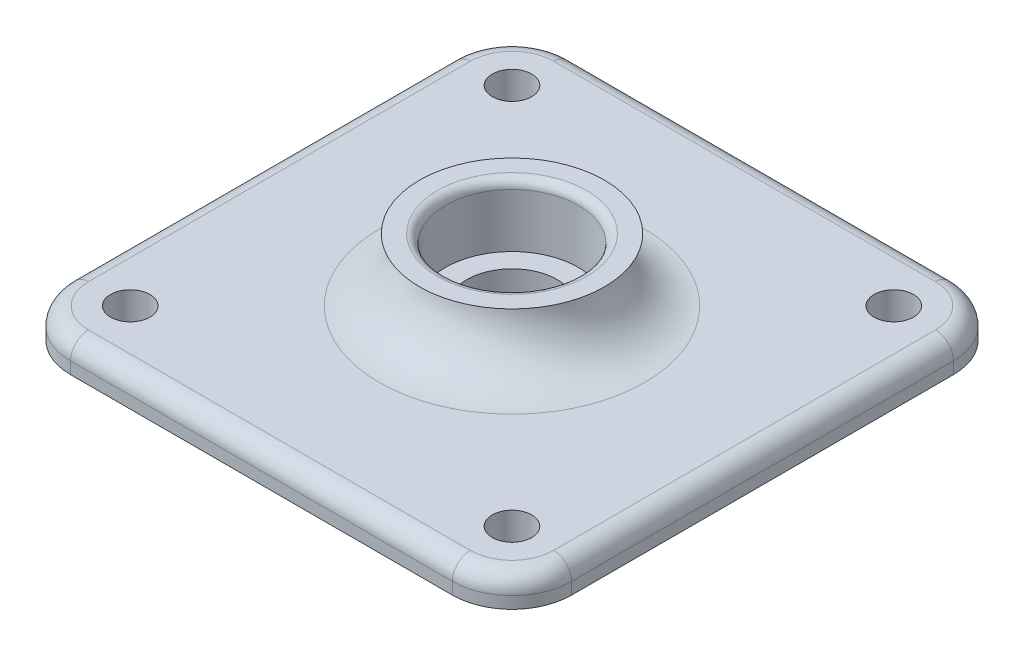
ISO-10303-21;
HEADER;
FILE_DESCRIPTION(('STEP AP214'),'2;1');
FILE_NAME('part.step','',(''),(''),'','','');
FILE_SCHEMA(('AUTOMOTIVE_DESIGN { 1 0 10303 214 1 1 1 1 }'));
ENDSEC;
DATA;
#1=APPLICATION_CONTEXT('core data for automotive mechanical design processes');
#2=APPLICATION_PROTOCOL_DEFINITION('international standard','automotive_design',2000,#1);
#3=PRODUCT_CONTEXT('',#1,'mechanical');
#4=PRODUCT('Part','Part','',(#3));
#5=PRODUCT_RELATED_PRODUCT_CATEGORY('part','',(#4));
#6=PRODUCT_DEFINITION_FORMATION('','',#4);
#7=PRODUCT_DEFINITION_CONTEXT('part definition',#1,'design');
#8=PRODUCT_DEFINITION('design','',#6,#7);
#9=PRODUCT_DEFINITION_SHAPE('','',#8);
#10=(LENGTH_UNIT() NAMED_UNIT(*) SI_UNIT(.MILLI.,.METRE.));
#11=(NAMED_UNIT(*) PLANE_ANGLE_UNIT() SI_UNIT($,.RADIAN.));
#12=(NAMED_UNIT(*) SI_UNIT($,.STERADIAN.) SOLID_ANGLE_UNIT());
#13=UNCERTAINTY_MEASURE_WITH_UNIT(LENGTH_MEASURE(1.E-05),#10,'distance_accuracy_value','');
#14=(GEOMETRIC_REPRESENTATION_CONTEXT(3) GLOBAL_UNCERTAINTY_ASSIGNED_CONTEXT((#13)) GLOBAL_UNIT_ASSIGNED_CONTEXT((#10,
#11,#12)) REPRESENTATION_CONTEXT('',''));
#15=CARTESIAN_POINT('',(0.,0.,0.));
#16=DIRECTION('',(0.,0.,1.));
#17=DIRECTION('',(1.,0.,0.));
#18=AXIS2_PLACEMENT_3D('',#15,#16,#17);
#19=CARTESIAN_POINT('',(32.,5.,-32.));
#20=DIRECTION('',(0.,-1.,0.));
#21=DIRECTION('',(0.,0.,-1.));
#22=AXIS2_PLACEMENT_3D('',#19,#20,#21);
#23=CYLINDRICAL_SURFACE('',#22,10.);
#24=DIRECTION('',(0.,-1.,0.));
#25=VECTOR('',#24,1.);
#26=CARTESIAN_POINT('',(32.,5.,-42.));
#27=LINE('',#26,#25);
#28=CARTESIAN_POINT('',(32.,2.,-42.));
#29=VERTEX_POINT('',#28);
#30=CARTESIAN_POINT('',(32.,0.,-42.));
#31=VERTEX_POINT('',#30);
#32=EDGE_CURVE('E171',#29,#31,#27,.T.);
#33=ORIENTED_EDGE('',*,*,#32,.F.);
#34=CARTESIAN_POINT('',(32.,2.,-32.));
#35=DIRECTION('',(0.,-1.,0.));
#36=DIRECTION('',(0.,0.,-1.));
#37=AXIS2_PLACEMENT_3D('',#34,#35,#36);
#38=CIRCLE('',#37,10.);
#39=CARTESIAN_POINT('',(42.,2.,-32.));
#40=VERTEX_POINT('',#39);
#41=EDGE_CURVE('E131',#29,#40,#38,.T.);
#42=ORIENTED_EDGE('',*,*,#41,.T.);
#43=DIRECTION('',(0.,-1.,0.));
#44=VECTOR('',#43,1.);
#45=CARTESIAN_POINT('',(42.,5.,-32.));
#46=LINE('',#45,#44);
#47=CARTESIAN_POINT('',(42.,0.,-32.));
#48=VERTEX_POINT('',#47);
#49=EDGE_CURVE('E125',#40,#48,#46,.T.);
#50=ORIENTED_EDGE('',*,*,#49,.T.);
#51=CARTESIAN_POINT('',(32.,0.,-32.));
#52=DIRECTION('',(0.,-1.,0.));
#53=DIRECTION('',(0.,0.,-1.));
#54=AXIS2_PLACEMENT_3D('',#51,#52,#53);
#55=CIRCLE('',#54,10.);
#56=EDGE_CURVE('E129',#31,#48,#55,.T.);
#57=ORIENTED_EDGE('',*,*,#56,.F.);
#58=EDGE_LOOP('',(#33,#42,#50,#57));
#59=FACE_BOUND('',#58,.T.);
#60=ADVANCED_FACE('F36',(#59),#23,.T.);
#61=CARTESIAN_POINT('',(32.,5.,-42.));
#62=DIRECTION('',(0.,0.,1.));
#63=DIRECTION('',(1.,0.,0.));
#64=AXIS2_PLACEMENT_3D('',#61,#62,#63);
#65=PLANE('',#64);
#66=DIRECTION('',(0.,-1.,0.));
#67=VECTOR('',#66,1.);
#68=CARTESIAN_POINT('',(-32.,5.,-42.));
#69=LINE('',#68,#67);
#70=CARTESIAN_POINT('',(-32.,2.,-42.));
#71=VERTEX_POINT('',#70);
#72=CARTESIAN_POINT('',(-32.,0.,-42.));
#73=VERTEX_POINT('',#72);
#74=EDGE_CURVE('E174',#71,#73,#69,.T.);
#75=ORIENTED_EDGE('',*,*,#74,.F.);
#76=DIRECTION('',(-1.,0.,0.));
#77=VECTOR('',#76,1.);
#78=CARTESIAN_POINT('',(32.,2.,-42.));
#79=LINE('',#78,#77);
#80=EDGE_CURVE('E205',#71,#29,#79,.F.);
#81=ORIENTED_EDGE('',*,*,#80,.T.);
#82=ORIENTED_EDGE('',*,*,#32,.T.);
#83=DIRECTION('',(-1.,0.,0.));
#84=VECTOR('',#83,1.);
#85=CARTESIAN_POINT('',(32.,0.,-42.));
#86=LINE('',#85,#84);
#87=EDGE_CURVE('E136',#31,#73,#86,.T.);
#88=ORIENTED_EDGE('',*,*,#87,.T.);
#89=EDGE_LOOP('',(#75,#81,#82,#88));
#90=FACE_BOUND('',#89,.T.);
#91=ADVANCED_FACE('F291',(#90),#65,.F.);
#92=CARTESIAN_POINT('',(-32.,5.,-32.));
#93=DIRECTION('',(0.,-1.,0.));
#94=DIRECTION('',(0.,0.,-1.));
#95=AXIS2_PLACEMENT_3D('',#92,#93,#94);
#96=CYLINDRICAL_SURFACE('',#95,10.);
#97=DIRECTION('',(0.,-1.,0.));
#98=VECTOR('',#97,1.);
#99=CARTESIAN_POINT('',(-42.,5.,-32.));
#100=LINE('',#99,#98);
#101=CARTESIAN_POINT('',(-42.,2.,-32.));
#102=VERTEX_POINT('',#101);
#103=CARTESIAN_POINT('',(-42.,0.,-32.));
#104=VERTEX_POINT('',#103);
#105=EDGE_CURVE('E176',#102,#104,#100,.T.);
#106=ORIENTED_EDGE('',*,*,#105,.F.);
#107=CARTESIAN_POINT('',(-32.,2.,-32.));
#108=DIRECTION('',(0.,-1.,0.));
#109=DIRECTION('',(0.,0.,-1.));
#110=AXIS2_PLACEMENT_3D('',#107,#108,#109);
#111=CIRCLE('',#110,10.);
#112=EDGE_CURVE('E207',#102,#71,#111,.T.);
#113=ORIENTED_EDGE('',*,*,#112,.T.);
#114=ORIENTED_EDGE('',*,*,#74,.T.);
#115=CARTESIAN_POINT('',(-32.,0.,-32.));
#116=DIRECTION('',(0.,1.,0.));
#117=DIRECTION('',(0.,0.,1.));
#118=AXIS2_PLACEMENT_3D('',#115,#116,#117);
#119=CIRCLE('',#118,10.);
#120=EDGE_CURVE('E167',#73,#104,#119,.T.);
#121=ORIENTED_EDGE('',*,*,#120,.T.);
#122=EDGE_LOOP('',(#106,#113,#114,#121));
#123=FACE_BOUND('',#122,.T.);
#124=ADVANCED_FACE('F296',(#123),#96,.T.);
#125=CARTESIAN_POINT('',(-42.,5.,-32.));
#126=DIRECTION('',(1.,0.,0.));
#127=DIRECTION('',(0.,0.,-1.));
#128=AXIS2_PLACEMENT_3D('',#125,#126,#127);
#129=PLANE('',#128);
#130=DIRECTION('',(0.,-1.,0.));
#131=VECTOR('',#130,1.);
#132=CARTESIAN_POINT('',(-42.,5.,32.));
#133=LINE('',#132,#131);
#134=CARTESIAN_POINT('',(-42.,2.,32.));
#135=VERTEX_POINT('',#134);
#136=CARTESIAN_POINT('',(-42.,0.,32.));
#137=VERTEX_POINT('',#136);
#138=EDGE_CURVE('E178',#135,#137,#133,.T.);
#139=ORIENTED_EDGE('',*,*,#138,.F.);
#140=DIRECTION('',(0.,0.,1.));
#141=VECTOR('',#140,1.);
#142=CARTESIAN_POINT('',(-42.,2.,-32.));
#143=LINE('',#142,#141);
#144=EDGE_CURVE('E209',#135,#102,#143,.F.);
#145=ORIENTED_EDGE('',*,*,#144,.T.);
#146=ORIENTED_EDGE('',*,*,#105,.T.);
#147=DIRECTION('',(0.,0.,1.));
#148=VECTOR('',#147,1.);
#149=CARTESIAN_POINT('',(-42.,0.,-32.));
#150=LINE('',#149,#148);
#151=EDGE_CURVE('E164',#104,#137,#150,.T.);
#152=ORIENTED_EDGE('',*,*,#151,.T.);
#153=EDGE_LOOP('',(#139,#145,#146,#152));
#154=FACE_BOUND('',#153,.T.);
#155=ADVANCED_FACE('F363',(#154),#129,.F.);
#156=CARTESIAN_POINT('',(-32.,5.,32.));
#157=DIRECTION('',(0.,-1.,0.));
#158=DIRECTION('',(0.,0.,-1.));
#159=AXIS2_PLACEMENT_3D('',#156,#157,#158);
#160=CYLINDRICAL_SURFACE('',#159,10.);
#161=DIRECTION('',(0.,-1.,0.));
#162=VECTOR('',#161,1.);
#163=CARTESIAN_POINT('',(-32.,5.,42.));
#164=LINE('',#163,#162);
#165=CARTESIAN_POINT('',(-32.,2.,42.));
#166=VERTEX_POINT('',#165);
#167=CARTESIAN_POINT('',(-32.,0.,42.));
#168=VERTEX_POINT('',#167);
#169=EDGE_CURVE('E180',#166,#168,#164,.T.);
#170=ORIENTED_EDGE('',*,*,#169,.F.);
#171=CARTESIAN_POINT('',(-32.,2.,32.));
#172=DIRECTION('',(0.,-1.,0.));
#173=DIRECTION('',(0.,0.,-1.));
#174=AXIS2_PLACEMENT_3D('',#171,#172,#173);
#175=CIRCLE('',#174,10.);
#176=EDGE_CURVE('E211',#166,#135,#175,.T.);
#177=ORIENTED_EDGE('',*,*,#176,.T.);
#178=ORIENTED_EDGE('',*,*,#138,.T.);
#179=CARTESIAN_POINT('',(-32.,0.,32.));
#180=DIRECTION('',(0.,-1.,0.));
#181=DIRECTION('',(0.,0.,-1.));
#182=AXIS2_PLACEMENT_3D('',#179,#180,#181);
#183=CIRCLE('',#182,10.);
#184=EDGE_CURVE('E161',#168,#137,#183,.T.);
#185=ORIENTED_EDGE('',*,*,#184,.F.);
#186=EDGE_LOOP('',(#170,#177,#178,#185));
#187=FACE_BOUND('',#186,.T.);
#188=ADVANCED_FACE('F360',(#187),#160,.T.);
#189=CARTESIAN_POINT('',(32.,5.,42.));
#190=DIRECTION('',(0.,0.,1.));
#191=DIRECTION('',(1.,0.,0.));
#192=AXIS2_PLACEMENT_3D('',#189,#190,#191);
#193=PLANE('',#192);
#194=DIRECTION('',(0.,-1.,0.));
#195=VECTOR('',#194,1.);
#196=CARTESIAN_POINT('',(32.,5.,42.));
#197=LINE('',#196,#195);
#198=CARTESIAN_POINT('',(32.,2.,42.));
#199=VERTEX_POINT('',#198);
#200=CARTESIAN_POINT('',(32.,0.,42.));
#201=VERTEX_POINT('',#200);
#202=EDGE_CURVE('E182',#199,#201,#197,.T.);
#203=ORIENTED_EDGE('',*,*,#202,.F.);
#204=DIRECTION('',(-1.,0.,0.));
#205=VECTOR('',#204,1.);
#206=CARTESIAN_POINT('',(-32.,2.,42.));
#207=LINE('',#206,#205);
#208=EDGE_CURVE('E45',#199,#166,#207,.T.);
#209=ORIENTED_EDGE('',*,*,#208,.T.);
#210=ORIENTED_EDGE('',*,*,#169,.T.);
#211=DIRECTION('',(-1.,0.,0.));
#212=VECTOR('',#211,1.);
#213=CARTESIAN_POINT('',(32.,0.,42.));
#214=LINE('',#213,#212);
#215=EDGE_CURVE('E158',#201,#168,#214,.T.);
#216=ORIENTED_EDGE('',*,*,#215,.F.);
#217=EDGE_LOOP('',(#203,#209,#210,#216));
#218=FACE_BOUND('',#217,.T.);
#219=ADVANCED_FACE('F357',(#218),#193,.T.);
#220=CARTESIAN_POINT('',(32.,5.,32.));
#221=DIRECTION('',(0.,-1.,0.));
#222=DIRECTION('',(0.,0.,-1.));
#223=AXIS2_PLACEMENT_3D('',#220,#221,#222);
#224=CYLINDRICAL_SURFACE('',#223,9.99999999999999);
#225=DIRECTION('',(0.,-1.,0.));
#226=VECTOR('',#225,1.);
#227=CARTESIAN_POINT('',(42.,5.,32.));
#228=LINE('',#227,#226);
#229=CARTESIAN_POINT('',(42.,2.,32.));
#230=VERTEX_POINT('',#229);
#231=CARTESIAN_POINT('',(42.,0.,32.));
#232=VERTEX_POINT('',#231);
#233=EDGE_CURVE('E135',#230,#232,#228,.T.);
#234=ORIENTED_EDGE('',*,*,#233,.F.);
#235=CARTESIAN_POINT('',(32.,2.,32.));
#236=DIRECTION('',(0.,-1.,0.));
#237=DIRECTION('',(0.,0.,-1.));
#238=AXIS2_PLACEMENT_3D('',#235,#236,#237);
#239=CIRCLE('',#238,9.99999999999999);
#240=EDGE_CURVE('E11',#230,#199,#239,.T.);
#241=ORIENTED_EDGE('',*,*,#240,.T.);
#242=ORIENTED_EDGE('',*,*,#202,.T.);
#243=CARTESIAN_POINT('',(32.,0.,32.));
#244=DIRECTION('',(0.,-1.,0.));
#245=DIRECTION('',(0.,0.,-1.));
#246=AXIS2_PLACEMENT_3D('',#243,#244,#245);
#247=CIRCLE('',#246,9.99999999999999);
#248=EDGE_CURVE('E144',#232,#201,#247,.T.);
#249=ORIENTED_EDGE('',*,*,#248,.F.);
#250=EDGE_LOOP('',(#234,#241,#242,#249));
#251=FACE_BOUND('',#250,.T.);
#252=ADVANCED_FACE('F353',(#251),#224,.T.);
#253=CARTESIAN_POINT('',(42.,5.,-32.));
#254=DIRECTION('',(1.,0.,0.));
#255=DIRECTION('',(0.,0.,-1.));
#256=AXIS2_PLACEMENT_3D('',#253,#254,#255);
#257=PLANE('',#256);
#258=ORIENTED_EDGE('',*,*,#49,.F.);
#259=DIRECTION('',(0.,0.,1.));
#260=VECTOR('',#259,1.);
#261=CARTESIAN_POINT('',(42.,2.,32.));
#262=LINE('',#261,#260);
#263=EDGE_CURVE('E185',#40,#230,#262,.T.);
#264=ORIENTED_EDGE('',*,*,#263,.T.);
#265=ORIENTED_EDGE('',*,*,#233,.T.);
#266=DIRECTION('',(0.,0.,1.));
#267=VECTOR('',#266,1.);
#268=CARTESIAN_POINT('',(42.,0.,-32.));
#269=LINE('',#268,#267);
#270=EDGE_CURVE('E139',#48,#232,#269,.T.);
#271=ORIENTED_EDGE('',*,*,#270,.F.);
#272=EDGE_LOOP('',(#258,#264,#265,#271));
#273=FACE_BOUND('',#272,.T.);
#274=ADVANCED_FACE('F140',(#273),#257,.T.);
#275=CARTESIAN_POINT('',(32.,5.,-32.));
#276=DIRECTION('',(0.,-1.,0.));
#277=DIRECTION('',(0.,0.,-1.));
#278=AXIS2_PLACEMENT_3D('',#275,#276,#277);
#279=PLANE('',#278);
#280=CARTESIAN_POINT('',(-32.,5.,-32.));
#281=DIRECTION('',(0.,1.,0.));
#282=DIRECTION('',(0.,0.,1.));
#283=AXIS2_PLACEMENT_3D('',#280,#281,#282);
#284=CIRCLE('',#283,3.3);
#285=CARTESIAN_POINT('',(-32.,5.,-28.7));
#286=VERTEX_POINT('',#285);
#287=EDGE_CURVE('E594',#286,#286,#284,.T.);
#288=ORIENTED_EDGE('',*,*,#287,.F.);
#289=EDGE_LOOP('',(#288));
#290=FACE_BOUND('',#289,.T.);
#291=CARTESIAN_POINT('',(-32.,5.,32.));
#292=DIRECTION('',(0.,1.,0.));
#293=DIRECTION('',(0.,0.,1.));
#294=AXIS2_PLACEMENT_3D('',#291,#292,#293);
#295=CIRCLE('',#294,3.3);
#296=CARTESIAN_POINT('',(-32.,5.,35.3));
#297=VERTEX_POINT('',#296);
#298=EDGE_CURVE('E596',#297,#297,#295,.T.);
#299=ORIENTED_EDGE('',*,*,#298,.F.);
#300=EDGE_LOOP('',(#299));
#301=FACE_BOUND('',#300,.T.);
#302=CARTESIAN_POINT('',(32.,5.,32.));
#303=DIRECTION('',(0.,1.,0.));
#304=DIRECTION('',(0.,0.,1.));
#305=AXIS2_PLACEMENT_3D('',#302,#303,#304);
#306=CIRCLE('',#305,3.3);
#307=CARTESIAN_POINT('',(32.,5.,35.3));
#308=VERTEX_POINT('',#307);
#309=EDGE_CURVE('E246',#308,#308,#306,.T.);
#310=ORIENTED_EDGE('',*,*,#309,.F.);
#311=EDGE_LOOP('',(#310));
#312=FACE_BOUND('',#311,.T.);
#313=CARTESIAN_POINT('',(32.,5.,-32.));
#314=DIRECTION('',(0.,1.,0.));
#315=DIRECTION('',(0.,0.,1.));
#316=AXIS2_PLACEMENT_3D('',#313,#314,#315);
#317=CIRCLE('',#316,3.3);
#318=CARTESIAN_POINT('',(32.,5.,-28.7));
#319=VERTEX_POINT('',#318);
#320=EDGE_CURVE('E238',#319,#319,#317,.T.);
#321=ORIENTED_EDGE('',*,*,#320,.F.);
#322=EDGE_LOOP('',(#321));
#323=FACE_BOUND('',#322,.T.);
#324=CARTESIAN_POINT('',(32.,5.,32.));
#325=DIRECTION('',(0.,-1.,0.));
#326=DIRECTION('',(0.,0.,-1.));
#327=AXIS2_PLACEMENT_3D('',#324,#325,#326);
#328=CIRCLE('',#327,6.99999999999999);
#329=CARTESIAN_POINT('',(32.,5.,39.));
#330=VERTEX_POINT('',#329);
#331=CARTESIAN_POINT('',(39.,5.,32.));
#332=VERTEX_POINT('',#331);
#333=EDGE_CURVE('E187',#330,#332,#328,.F.);
#334=ORIENTED_EDGE('',*,*,#333,.T.);
#335=DIRECTION('',(0.,0.,1.));
#336=VECTOR('',#335,1.);
#337=CARTESIAN_POINT('',(39.,5.,-32.));
#338=LINE('',#337,#336);
#339=CARTESIAN_POINT('',(39.,5.,-32.));
#340=VERTEX_POINT('',#339);
#341=EDGE_CURVE('E201',#332,#340,#338,.F.);
#342=ORIENTED_EDGE('',*,*,#341,.T.);
#343=CARTESIAN_POINT('',(32.,5.,-32.));
#344=DIRECTION('',(0.,-1.,0.));
#345=DIRECTION('',(0.,0.,-1.));
#346=AXIS2_PLACEMENT_3D('',#343,#344,#345);
#347=CIRCLE('',#346,7.);
#348=CARTESIAN_POINT('',(32.,5.,-39.));
#349=VERTEX_POINT('',#348);
#350=EDGE_CURVE('E199',#340,#349,#347,.F.);
#351=ORIENTED_EDGE('',*,*,#350,.T.);
#352=DIRECTION('',(-1.,0.,0.));
#353=VECTOR('',#352,1.);
#354=CARTESIAN_POINT('',(32.,5.,-39.));
#355=LINE('',#354,#353);
#356=CARTESIAN_POINT('',(-32.,5.,-39.));
#357=VERTEX_POINT('',#356);
#358=EDGE_CURVE('E197',#349,#357,#355,.T.);
#359=ORIENTED_EDGE('',*,*,#358,.T.);
#360=CARTESIAN_POINT('',(-32.,5.,-32.));
#361=DIRECTION('',(0.,-1.,0.));
#362=DIRECTION('',(0.,0.,-1.));
#363=AXIS2_PLACEMENT_3D('',#360,#361,#362);
#364=CIRCLE('',#363,7.);
#365=CARTESIAN_POINT('',(-39.,5.,-32.));
#366=VERTEX_POINT('',#365);
#367=EDGE_CURVE('E195',#357,#366,#364,.F.);
#368=ORIENTED_EDGE('',*,*,#367,.T.);
#369=DIRECTION('',(0.,0.,1.));
#370=VECTOR('',#369,1.);
#371=CARTESIAN_POINT('',(-39.,5.,-32.));
#372=LINE('',#371,#370);
#373=CARTESIAN_POINT('',(-39.,5.,32.));
#374=VERTEX_POINT('',#373);
#375=EDGE_CURVE('E193',#366,#374,#372,.T.);
#376=ORIENTED_EDGE('',*,*,#375,.T.);
#377=CARTESIAN_POINT('',(-32.,5.,32.));
#378=DIRECTION('',(0.,-1.,0.));
#379=DIRECTION('',(0.,0.,-1.));
#380=AXIS2_PLACEMENT_3D('',#377,#378,#379);
#381=CIRCLE('',#380,7.);
#382=CARTESIAN_POINT('',(-32.,5.,39.));
#383=VERTEX_POINT('',#382);
#384=EDGE_CURVE('E191',#374,#383,#381,.F.);
#385=ORIENTED_EDGE('',*,*,#384,.T.);
#386=DIRECTION('',(-1.,0.,0.));
#387=VECTOR('',#386,1.);
#388=CARTESIAN_POINT('',(32.,5.,39.));
#389=LINE('',#388,#387);
#390=EDGE_CURVE('E189',#383,#330,#389,.F.);
#391=ORIENTED_EDGE('',*,*,#390,.T.);
#392=EDGE_LOOP('',(#334,#342,#351,#359,#368,#376,#385,#391));
#393=FACE_BOUND('',#392,.T.);
#394=CARTESIAN_POINT('',(0.,5.,0.));
#395=DIRECTION('',(0.,1.,0.));
#396=DIRECTION('',(0.,0.,1.));
#397=AXIS2_PLACEMENT_3D('',#394,#395,#396);
#398=CIRCLE('',#397,22.25);
#399=CARTESIAN_POINT('',(0.,5.,22.25));
#400=VERTEX_POINT('',#399);
#401=EDGE_CURVE('E173',#400,#400,#398,.T.);
#402=ORIENTED_EDGE('',*,*,#401,.F.);
#403=EDGE_LOOP('',(#402));
#404=FACE_BOUND('',#403,.T.);
#405=ADVANCED_FACE('F343',(#290,#301,#312,#323,#393,#404),#279,.F.);
#406=CARTESIAN_POINT('',(32.,0.,-32.));
#407=DIRECTION('',(0.,-1.,0.));
#408=DIRECTION('',(0.,0.,-1.));
#409=AXIS2_PLACEMENT_3D('',#406,#407,#408);
#410=PLANE('',#409);
#411=CARTESIAN_POINT('',(-32.,0.,-32.));
#412=DIRECTION('',(0.,-1.,0.));
#413=DIRECTION('',(0.,0.,-1.));
#414=AXIS2_PLACEMENT_3D('',#411,#412,#413);
#415=CIRCLE('',#414,3.3);
#416=CARTESIAN_POINT('',(-32.,0.,-35.3));
#417=VERTEX_POINT('',#416);
#418=EDGE_CURVE('E592',#417,#417,#415,.T.);
#419=ORIENTED_EDGE('',*,*,#418,.F.);
#420=EDGE_LOOP('',(#419));
#421=FACE_BOUND('',#420,.T.);
#422=CARTESIAN_POINT('',(-32.,0.,32.));
#423=DIRECTION('',(0.,-1.,0.));
#424=DIRECTION('',(0.,0.,-1.));
#425=AXIS2_PLACEMENT_3D('',#422,#423,#424);
#426=CIRCLE('',#425,3.3);
#427=CARTESIAN_POINT('',(-32.,0.,28.7));
#428=VERTEX_POINT('',#427);
#429=EDGE_CURVE('E600',#428,#428,#426,.T.);
#430=ORIENTED_EDGE('',*,*,#429,.F.);
#431=EDGE_LOOP('',(#430));
#432=FACE_BOUND('',#431,.T.);
#433=CARTESIAN_POINT('',(32.,0.,32.));
#434=DIRECTION('',(0.,-1.,0.));
#435=DIRECTION('',(0.,0.,-1.));
#436=AXIS2_PLACEMENT_3D('',#433,#434,#435);
#437=CIRCLE('',#436,3.3);
#438=CARTESIAN_POINT('',(32.,0.,28.7));
#439=VERTEX_POINT('',#438);
#440=EDGE_CURVE('E40',#439,#439,#437,.T.);
#441=ORIENTED_EDGE('',*,*,#440,.F.);
#442=EDGE_LOOP('',(#441));
#443=FACE_BOUND('',#442,.T.);
#444=CARTESIAN_POINT('',(32.,0.,-32.));
#445=DIRECTION('',(0.,-1.,0.));
#446=DIRECTION('',(0.,0.,-1.));
#447=AXIS2_PLACEMENT_3D('',#444,#445,#446);
#448=CIRCLE('',#447,3.3);
#449=CARTESIAN_POINT('',(32.,0.,-35.3));
#450=VERTEX_POINT('',#449);
#451=EDGE_CURVE('E217',#450,#450,#448,.T.);
#452=ORIENTED_EDGE('',*,*,#451,.F.);
#453=EDGE_LOOP('',(#452));
#454=FACE_BOUND('',#453,.T.);
#455=CARTESIAN_POINT('',(0.,0.,0.));
#456=DIRECTION('',(0.,1.,0.));
#457=DIRECTION('',(0.,0.,1.));
#458=AXIS2_PLACEMENT_3D('',#455,#456,#457);
#459=CIRCLE('',#458,9.6);
#460=CARTESIAN_POINT('',(0.,0.,9.6));
#461=VERTEX_POINT('',#460);
#462=EDGE_CURVE('E252',#461,#461,#459,.T.);
#463=ORIENTED_EDGE('',*,*,#462,.T.);
#464=EDGE_LOOP('',(#463));
#465=FACE_BOUND('',#464,.T.);
#466=ORIENTED_EDGE('',*,*,#56,.T.);
#467=ORIENTED_EDGE('',*,*,#270,.T.);
#468=ORIENTED_EDGE('',*,*,#248,.T.);
#469=ORIENTED_EDGE('',*,*,#215,.T.);
#470=ORIENTED_EDGE('',*,*,#184,.T.);
#471=ORIENTED_EDGE('',*,*,#151,.F.);
#472=ORIENTED_EDGE('',*,*,#120,.F.);
#473=ORIENTED_EDGE('',*,*,#87,.F.);
#474=EDGE_LOOP('',(#466,#467,#468,#469,#470,#471,#472,#473));
#475=FACE_BOUND('',#474,.T.);
#476=ADVANCED_FACE('F147',(#421,#432,#443,#454,#465,#475),#410,.T.);
#477=CARTESIAN_POINT('',(0.,0.,0.));
#478=DIRECTION('',(0.,1.,0.));
#479=DIRECTION('',(0.,0.,1.));
#480=AXIS2_PLACEMENT_3D('',#477,#478,#479);
#481=CYLINDRICAL_SURFACE('',#480,11.15);
#482=CARTESIAN_POINT('',(0.,5.00000000000001,0.));
#483=DIRECTION('',(0.,1.,0.));
#484=DIRECTION('',(0.,0.,1.));
#485=AXIS2_PLACEMENT_3D('',#482,#483,#484);
#486=CIRCLE('',#485,11.15);
#487=CARTESIAN_POINT('',(0.,5.00000000000001,11.15));
#488=VERTEX_POINT('',#487);
#489=EDGE_CURVE('E258',#488,#488,#486,.T.);
#490=ORIENTED_EDGE('',*,*,#489,.F.);
#491=EDGE_LOOP('',(#490));
#492=FACE_BOUND('',#491,.T.);
#493=CARTESIAN_POINT('',(0.,14.,0.));
#494=DIRECTION('',(0.,1.,0.));
#495=DIRECTION('',(0.,0.,1.));
#496=AXIS2_PLACEMENT_3D('',#493,#494,#495);
#497=CIRCLE('',#496,11.15);
#498=CARTESIAN_POINT('',(0.,14.,11.15));
#499=VERTEX_POINT('',#498);
#500=EDGE_CURVE('E150',#499,#499,#497,.T.);
#501=ORIENTED_EDGE('',*,*,#500,.T.);
#502=EDGE_LOOP('',(#501));
#503=FACE_BOUND('',#502,.T.);
#504=ADVANCED_FACE('F390',(#492,#503),#481,.F.);
#505=CARTESIAN_POINT('',(0.,14.,0.));
#506=DIRECTION('',(0.,1.,0.));
#507=DIRECTION('',(0.,0.,1.));
#508=AXIS2_PLACEMENT_3D('',#505,#506,#507);
#509=TOROIDAL_SURFACE('',#508,12.6583333333333,1.50833333333334);
#510=ORIENTED_EDGE('',*,*,#500,.F.);
#511=EDGE_LOOP('',(#510));
#512=FACE_BOUND('',#511,.T.);
#513=CARTESIAN_POINT('',(0.,15.5,0.));
#514=DIRECTION('',(0.,1.,0.));
#515=DIRECTION('',(0.,0.,1.));
#516=AXIS2_PLACEMENT_3D('',#513,#514,#515);
#517=CIRCLE('',#516,12.5);
#518=CARTESIAN_POINT('',(0.,15.5,12.5));
#519=VERTEX_POINT('',#518);
#520=EDGE_CURVE('E153',#519,#519,#517,.T.);
#521=ORIENTED_EDGE('',*,*,#520,.T.);
#522=EDGE_LOOP('',(#521));
#523=FACE_BOUND('',#522,.T.);
#524=ADVANCED_FACE('F271',(#512,#523),#509,.T.);
#525=CARTESIAN_POINT('',(0.,15.5,0.));
#526=DIRECTION('',(0.,-1.,0.));
#527=DIRECTION('',(0.,0.,-1.));
#528=AXIS2_PLACEMENT_3D('',#525,#526,#527);
#529=PLANE('',#528);
#530=ORIENTED_EDGE('',*,*,#520,.F.);
#531=EDGE_LOOP('',(#530));
#532=FACE_BOUND('',#531,.T.);
#533=CARTESIAN_POINT('',(0.,15.5,0.));
#534=DIRECTION('',(0.,1.,0.));
#535=DIRECTION('',(0.,0.,1.));
#536=AXIS2_PLACEMENT_3D('',#533,#534,#535);
#537=CIRCLE('',#536,15.5);
#538=CARTESIAN_POINT('',(0.,15.5,15.5));
#539=VERTEX_POINT('',#538);
#540=EDGE_CURVE('E266',#539,#539,#537,.T.);
#541=ORIENTED_EDGE('',*,*,#540,.T.);
#542=EDGE_LOOP('',(#541));
#543=FACE_BOUND('',#542,.T.);
#544=ADVANCED_FACE('F273',(#532,#543),#529,.F.);
#545=CARTESIAN_POINT('',(0.,11.75,0.));
#546=DIRECTION('',(0.,1.,0.));
#547=DIRECTION('',(0.,0.,1.));
#548=AXIS2_PLACEMENT_3D('',#545,#546,#547);
#549=TOROIDAL_SURFACE('',#548,15.5,3.75);
#550=CARTESIAN_POINT('',(0.,14.,0.));
#551=DIRECTION('',(0.,1.,0.));
#552=DIRECTION('',(0.,0.,1.));
#553=AXIS2_PLACEMENT_3D('',#550,#551,#552);
#554=CIRCLE('',#553,12.5);
#555=CARTESIAN_POINT('',(0.,14.,12.5));
#556=VERTEX_POINT('',#555);
#557=EDGE_CURVE('E261',#556,#556,#554,.T.);
#558=ORIENTED_EDGE('',*,*,#557,.T.);
#559=EDGE_LOOP('',(#558));
#560=FACE_BOUND('',#559,.T.);
#561=ORIENTED_EDGE('',*,*,#540,.F.);
#562=EDGE_LOOP('',(#561));
#563=FACE_BOUND('',#562,.T.);
#564=ADVANCED_FACE('F276',(#560,#563),#549,.F.);
#565=CARTESIAN_POINT('',(0.,14.9979982924372,0.));
#566=DIRECTION('',(0.,1.,0.));
#567=DIRECTION('',(0.,0.,1.));
#568=AXIS2_PLACEMENT_3D('',#565,#566,#567);
#569=TOROIDAL_SURFACE('',#568,22.4500753468651,10.);
#570=ORIENTED_EDGE('',*,*,#401,.T.);
#571=EDGE_LOOP('',(#570));
#572=FACE_BOUND('',#571,.T.);
#573=ORIENTED_EDGE('',*,*,#557,.F.);
#574=EDGE_LOOP('',(#573));
#575=FACE_BOUND('',#574,.T.);
#576=ADVANCED_FACE('F281',(#572,#575),#569,.F.);
#577=CARTESIAN_POINT('',(0.,5.,0.));
#578=DIRECTION('',(0.,1.,0.));
#579=DIRECTION('',(0.,0.,1.));
#580=AXIS2_PLACEMENT_3D('',#577,#578,#579);
#581=CIRCLE('',#580,7.6);
#582=CARTESIAN_POINT('',(0.,5.,7.6));
#583=VERTEX_POINT('',#582);
#584=EDGE_CURVE('E236',#583,#583,#581,.T.);
#585=ORIENTED_EDGE('',*,*,#584,.F.);
#586=EDGE_LOOP('',(#585));
#587=FACE_BOUND('',#586,.T.);
#588=ORIENTED_EDGE('',*,*,#489,.T.);
#589=EDGE_LOOP('',(#588));
#590=FACE_BOUND('',#589,.T.);
#591=ADVANCED_FACE('F287',(#587,#590),#279,.F.);
#592=CARTESIAN_POINT('',(0.,2.00869631555949,0.));
#593=DIRECTION('',(0.,1.,0.));
#594=DIRECTION('',(0.,0.,1.));
#595=AXIS2_PLACEMENT_3D('',#592,#593,#594);
#596=TOROIDAL_SURFACE('',#595,7.37174078889871,3.);
#597=ORIENTED_EDGE('',*,*,#584,.T.);
#598=EDGE_LOOP('',(#597));
#599=FACE_BOUND('',#598,.T.);
#600=CARTESIAN_POINT('',(0.,4.01739263111897,0.));
#601=DIRECTION('',(0.,1.,0.));
#602=DIRECTION('',(0.,0.,1.));
#603=AXIS2_PLACEMENT_3D('',#600,#601,#602);
#604=CIRCLE('',#603,9.6);
#605=CARTESIAN_POINT('',(0.,4.01739263111897,9.6));
#606=VERTEX_POINT('',#605);
#607=EDGE_CURVE('E255',#606,#606,#604,.T.);
#608=ORIENTED_EDGE('',*,*,#607,.F.);
#609=EDGE_LOOP('',(#608));
#610=FACE_BOUND('',#609,.T.);
#611=ADVANCED_FACE('F396',(#599,#610),#596,.F.);
#612=CARTESIAN_POINT('',(0.,0.,0.));
#613=DIRECTION('',(0.,1.,0.));
#614=DIRECTION('',(0.,0.,1.));
#615=AXIS2_PLACEMENT_3D('',#612,#613,#614);
#616=CYLINDRICAL_SURFACE('',#615,9.6);
#617=ORIENTED_EDGE('',*,*,#462,.F.);
#618=EDGE_LOOP('',(#617));
#619=FACE_BOUND('',#618,.T.);
#620=ORIENTED_EDGE('',*,*,#607,.T.);
#621=EDGE_LOOP('',(#620));
#622=FACE_BOUND('',#621,.T.);
#623=ADVANCED_FACE('F332',(#619,#622),#616,.F.);
#624=CARTESIAN_POINT('',(-39.,2.,-32.));
#625=DIRECTION('',(0.,0.,1.));
#626=DIRECTION('',(1.,0.,0.));
#627=AXIS2_PLACEMENT_3D('',#624,#625,#626);
#628=CYLINDRICAL_SURFACE('',#627,3.);
#629=CARTESIAN_POINT('',(-39.,2.,32.));
#630=DIRECTION('',(0.,0.,1.));
#631=DIRECTION('',(1.,0.,0.));
#632=AXIS2_PLACEMENT_3D('',#629,#630,#631);
#633=CIRCLE('',#632,3.);
#634=EDGE_CURVE('E231',#374,#135,#633,.T.);
#635=ORIENTED_EDGE('',*,*,#634,.F.);
#636=ORIENTED_EDGE('',*,*,#375,.F.);
#637=CARTESIAN_POINT('',(-39.,2.,-32.));
#638=DIRECTION('',(0.,0.,-1.));
#639=DIRECTION('',(-1.,0.,0.));
#640=AXIS2_PLACEMENT_3D('',#637,#638,#639);
#641=CIRCLE('',#640,3.);
#642=EDGE_CURVE('E234',#102,#366,#641,.T.);
#643=ORIENTED_EDGE('',*,*,#642,.F.);
#644=ORIENTED_EDGE('',*,*,#144,.F.);
#645=EDGE_LOOP('',(#635,#636,#643,#644));
#646=FACE_BOUND('',#645,.T.);
#647=ADVANCED_FACE('F38',(#646),#628,.T.);
#648=CARTESIAN_POINT('',(-32.,2.,-32.));
#649=DIRECTION('',(0.,-1.,0.));
#650=DIRECTION('',(0.,0.,-1.));
#651=AXIS2_PLACEMENT_3D('',#648,#649,#650);
#652=TOROIDAL_SURFACE('',#651,7.,3.);
#653=ORIENTED_EDGE('',*,*,#642,.T.);
#654=ORIENTED_EDGE('',*,*,#367,.F.);
#655=CARTESIAN_POINT('',(-32.,2.,-39.));
#656=DIRECTION('',(1.,0.,0.));
#657=DIRECTION('',(0.,0.,-1.));
#658=AXIS2_PLACEMENT_3D('',#655,#656,#657);
#659=CIRCLE('',#658,3.);
#660=EDGE_CURVE('E228',#71,#357,#659,.T.);
#661=ORIENTED_EDGE('',*,*,#660,.F.);
#662=ORIENTED_EDGE('',*,*,#112,.F.);
#663=EDGE_LOOP('',(#653,#654,#661,#662));
#664=FACE_BOUND('',#663,.T.);
#665=ADVANCED_FACE('F325',(#664),#652,.T.);
#666=CARTESIAN_POINT('',(-32.,2.,32.));
#667=DIRECTION('',(0.,-1.,0.));
#668=DIRECTION('',(0.,0.,-1.));
#669=AXIS2_PLACEMENT_3D('',#666,#667,#668);
#670=TOROIDAL_SURFACE('',#669,7.,3.);
#671=ORIENTED_EDGE('',*,*,#634,.T.);
#672=ORIENTED_EDGE('',*,*,#176,.F.);
#673=CARTESIAN_POINT('',(-32.,2.,39.));
#674=DIRECTION('',(1.,0.,0.));
#675=DIRECTION('',(0.,0.,-1.));
#676=AXIS2_PLACEMENT_3D('',#673,#674,#675);
#677=CIRCLE('',#676,3.);
#678=EDGE_CURVE('E225',#383,#166,#677,.T.);
#679=ORIENTED_EDGE('',*,*,#678,.F.);
#680=ORIENTED_EDGE('',*,*,#384,.F.);
#681=EDGE_LOOP('',(#671,#672,#679,#680));
#682=FACE_BOUND('',#681,.T.);
#683=ADVANCED_FACE('F322',(#682),#670,.T.);
#684=CARTESIAN_POINT('',(32.,2.,-39.));
#685=DIRECTION('',(-1.,0.,0.));
#686=DIRECTION('',(0.,0.,1.));
#687=AXIS2_PLACEMENT_3D('',#684,#685,#686);
#688=CYLINDRICAL_SURFACE('',#687,3.);
#689=ORIENTED_EDGE('',*,*,#660,.T.);
#690=ORIENTED_EDGE('',*,*,#358,.F.);
#691=CARTESIAN_POINT('',(32.,2.,-39.));
#692=DIRECTION('',(1.,0.,0.));
#693=DIRECTION('',(0.,0.,-1.));
#694=AXIS2_PLACEMENT_3D('',#691,#692,#693);
#695=CIRCLE('',#694,3.);
#696=EDGE_CURVE('E222',#29,#349,#695,.T.);
#697=ORIENTED_EDGE('',*,*,#696,.F.);
#698=ORIENTED_EDGE('',*,*,#80,.F.);
#699=EDGE_LOOP('',(#689,#690,#697,#698));
#700=FACE_BOUND('',#699,.T.);
#701=ADVANCED_FACE('F318',(#700),#688,.T.);
#702=CARTESIAN_POINT('',(32.,2.,39.));
#703=DIRECTION('',(1.,0.,0.));
#704=DIRECTION('',(0.,0.,-1.));
#705=AXIS2_PLACEMENT_3D('',#702,#703,#704);
#706=CYLINDRICAL_SURFACE('',#705,3.);
#707=ORIENTED_EDGE('',*,*,#678,.T.);
#708=ORIENTED_EDGE('',*,*,#208,.F.);
#709=CARTESIAN_POINT('',(32.,2.,39.));
#710=DIRECTION('',(1.,0.,0.));
#711=DIRECTION('',(0.,0.,-1.));
#712=AXIS2_PLACEMENT_3D('',#709,#710,#711);
#713=CIRCLE('',#712,3.);
#714=EDGE_CURVE('E219',#330,#199,#713,.T.);
#715=ORIENTED_EDGE('',*,*,#714,.F.);
#716=ORIENTED_EDGE('',*,*,#390,.F.);
#717=EDGE_LOOP('',(#707,#708,#715,#716));
#718=FACE_BOUND('',#717,.T.);
#719=ADVANCED_FACE('F314',(#718),#706,.T.);
#720=CARTESIAN_POINT('',(32.,2.,-32.));
#721=DIRECTION('',(0.,-1.,0.));
#722=DIRECTION('',(0.,0.,-1.));
#723=AXIS2_PLACEMENT_3D('',#720,#721,#722);
#724=TOROIDAL_SURFACE('',#723,7.,3.);
#725=ORIENTED_EDGE('',*,*,#696,.T.);
#726=ORIENTED_EDGE('',*,*,#350,.F.);
#727=CARTESIAN_POINT('',(39.,2.,-32.));
#728=DIRECTION('',(0.,0.,1.));
#729=DIRECTION('',(1.,0.,0.));
#730=AXIS2_PLACEMENT_3D('',#727,#728,#729);
#731=CIRCLE('',#730,3.);
#732=EDGE_CURVE('E216',#40,#340,#731,.T.);
#733=ORIENTED_EDGE('',*,*,#732,.F.);
#734=ORIENTED_EDGE('',*,*,#41,.F.);
#735=EDGE_LOOP('',(#725,#726,#733,#734));
#736=FACE_BOUND('',#735,.T.);
#737=ADVANCED_FACE('F310',(#736),#724,.T.);
#738=CARTESIAN_POINT('',(32.,2.,32.));
#739=DIRECTION('',(0.,-1.,0.));
#740=DIRECTION('',(0.,0.,-1.));
#741=AXIS2_PLACEMENT_3D('',#738,#739,#740);
#742=TOROIDAL_SURFACE('',#741,6.99999999999999,3.);
#743=ORIENTED_EDGE('',*,*,#714,.T.);
#744=ORIENTED_EDGE('',*,*,#240,.F.);
#745=CARTESIAN_POINT('',(39.,2.,32.));
#746=DIRECTION('',(0.,0.,-1.));
#747=DIRECTION('',(-1.,0.,0.));
#748=AXIS2_PLACEMENT_3D('',#745,#746,#747);
#749=CIRCLE('',#748,3.);
#750=EDGE_CURVE('E214',#332,#230,#749,.T.);
#751=ORIENTED_EDGE('',*,*,#750,.F.);
#752=ORIENTED_EDGE('',*,*,#333,.F.);
#753=EDGE_LOOP('',(#743,#744,#751,#752));
#754=FACE_BOUND('',#753,.T.);
#755=ADVANCED_FACE('F306',(#754),#742,.T.);
#756=CARTESIAN_POINT('',(39.,2.,-32.));
#757=DIRECTION('',(0.,0.,-1.));
#758=DIRECTION('',(-1.,0.,0.));
#759=AXIS2_PLACEMENT_3D('',#756,#757,#758);
#760=CYLINDRICAL_SURFACE('',#759,3.);
#761=ORIENTED_EDGE('',*,*,#732,.T.);
#762=ORIENTED_EDGE('',*,*,#341,.F.);
#763=ORIENTED_EDGE('',*,*,#750,.T.);
#764=ORIENTED_EDGE('',*,*,#263,.F.);
#765=EDGE_LOOP('',(#761,#762,#763,#764));
#766=FACE_BOUND('',#765,.T.);
#767=ADVANCED_FACE('F302',(#766),#760,.T.);
#768=CARTESIAN_POINT('',(32.,5.,-32.));
#769=DIRECTION('',(0.,1.,0.));
#770=DIRECTION('',(0.,0.,1.));
#771=AXIS2_PLACEMENT_3D('',#768,#769,#770);
#772=CYLINDRICAL_SURFACE('',#771,3.3);
#773=ORIENTED_EDGE('',*,*,#451,.T.);
#774=EDGE_LOOP('',(#773));
#775=FACE_BOUND('',#774,.T.);
#776=ORIENTED_EDGE('',*,*,#320,.T.);
#777=EDGE_LOOP('',(#776));
#778=FACE_BOUND('',#777,.T.);
#779=ADVANCED_FACE('F305',(#775,#778),#772,.F.);
#780=CARTESIAN_POINT('',(32.,5.,32.));
#781=DIRECTION('',(0.,1.,0.));
#782=DIRECTION('',(0.,0.,1.));
#783=AXIS2_PLACEMENT_3D('',#780,#781,#782);
#784=CYLINDRICAL_SURFACE('',#783,3.3);
#785=ORIENTED_EDGE('',*,*,#440,.T.);
#786=EDGE_LOOP('',(#785));
#787=FACE_BOUND('',#786,.T.);
#788=ORIENTED_EDGE('',*,*,#309,.T.);
#789=EDGE_LOOP('',(#788));
#790=FACE_BOUND('',#789,.T.);
#791=ADVANCED_FACE('F556',(#787,#790),#784,.F.);
#792=CARTESIAN_POINT('',(-32.,5.,32.));
#793=DIRECTION('',(0.,1.,0.));
#794=DIRECTION('',(0.,0.,1.));
#795=AXIS2_PLACEMENT_3D('',#792,#793,#794);
#796=CYLINDRICAL_SURFACE('',#795,3.3);
#797=ORIENTED_EDGE('',*,*,#429,.T.);
#798=EDGE_LOOP('',(#797));
#799=FACE_BOUND('',#798,.T.);
#800=ORIENTED_EDGE('',*,*,#298,.T.);
#801=EDGE_LOOP('',(#800));
#802=FACE_BOUND('',#801,.T.);
#803=ADVANCED_FACE('F565',(#799,#802),#796,.F.);
#804=CARTESIAN_POINT('',(-32.,5.,-32.));
#805=DIRECTION('',(0.,1.,0.));
#806=DIRECTION('',(0.,0.,1.));
#807=AXIS2_PLACEMENT_3D('',#804,#805,#806);
#808=CYLINDRICAL_SURFACE('',#807,3.3);
#809=ORIENTED_EDGE('',*,*,#418,.T.);
#810=EDGE_LOOP('',(#809));
#811=FACE_BOUND('',#810,.T.);
#812=ORIENTED_EDGE('',*,*,#287,.T.);
#813=EDGE_LOOP('',(#812));
#814=FACE_BOUND('',#813,.T.);
#815=ADVANCED_FACE('F575',(#811,#814),#808,.F.);
#816=CLOSED_SHELL('',(#60,#91,#124,#155,#188,#219,#252,#274,#405,#476,#504,#524,#544,#564,#576,
#591,#611,#623,#647,#665,#683,#701,#719,#737,#755,#767,#779,#791,#803,#815));
#817=MANIFOLD_SOLID_BREP('B2',#816);
#818=ADVANCED_BREP_SHAPE_REPRESENTATION('',(#18,#817),#14);
#819=SHAPE_DEFINITION_REPRESENTATION(#9,#818);
ENDSEC;
END-ISO-10303-21;
